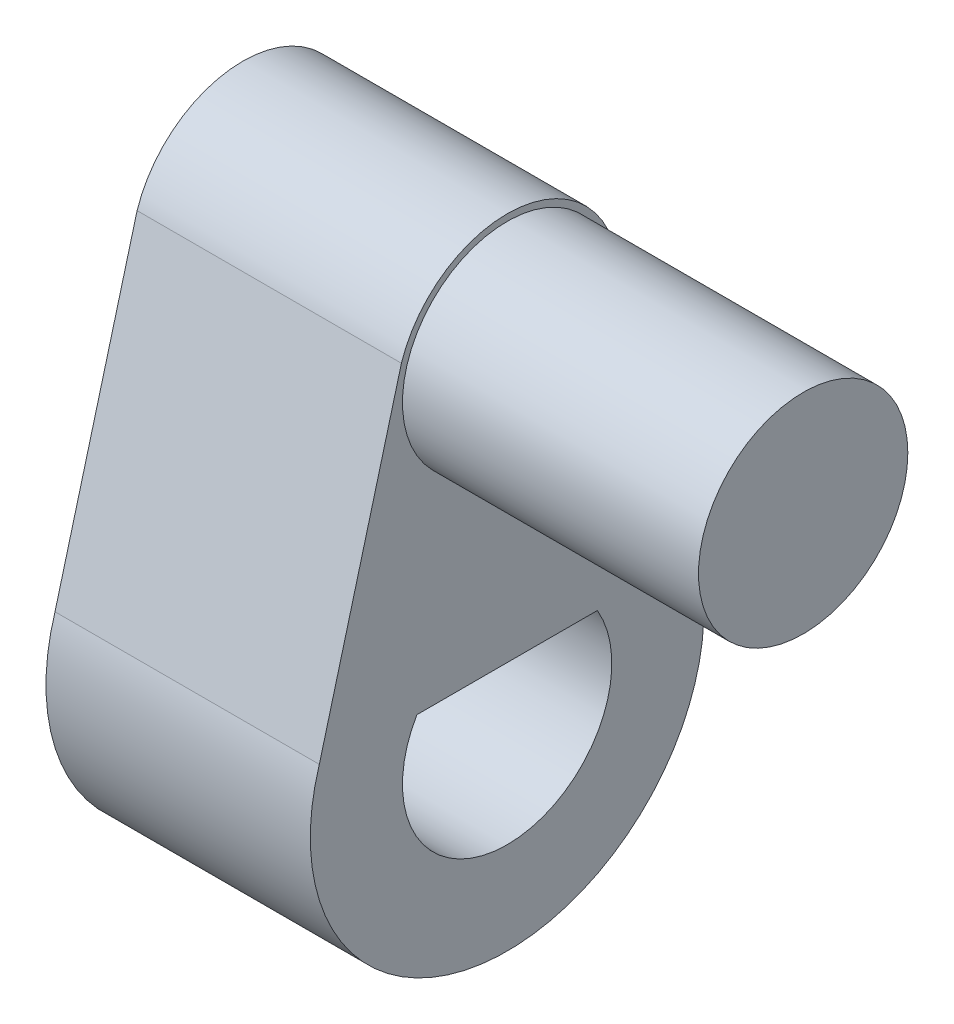
ISO-10303-21;
HEADER;
FILE_DESCRIPTION(('STEP AP214'),'2;1');
FILE_NAME('part.step','',(''),(''),'','','');
FILE_SCHEMA(('AUTOMOTIVE_DESIGN { 1 0 10303 214 1 1 1 1 }'));
ENDSEC;
DATA;
#1=APPLICATION_CONTEXT('core data for automotive mechanical design processes');
#2=APPLICATION_PROTOCOL_DEFINITION('international standard','automotive_design',2000,#1);
#3=PRODUCT_CONTEXT('',#1,'mechanical');
#4=PRODUCT('Part','Part','',(#3));
#5=PRODUCT_RELATED_PRODUCT_CATEGORY('part','',(#4));
#6=PRODUCT_DEFINITION_FORMATION('','',#4);
#7=PRODUCT_DEFINITION_CONTEXT('part definition',#1,'design');
#8=PRODUCT_DEFINITION('design','',#6,#7);
#9=PRODUCT_DEFINITION_SHAPE('','',#8);
#10=(LENGTH_UNIT() NAMED_UNIT(*) SI_UNIT(.MILLI.,.METRE.));
#11=(NAMED_UNIT(*) PLANE_ANGLE_UNIT() SI_UNIT($,.RADIAN.));
#12=(NAMED_UNIT(*) SI_UNIT($,.STERADIAN.) SOLID_ANGLE_UNIT());
#13=UNCERTAINTY_MEASURE_WITH_UNIT(LENGTH_MEASURE(1.E-05),#10,'distance_accuracy_value','');
#14=(GEOMETRIC_REPRESENTATION_CONTEXT(3) GLOBAL_UNCERTAINTY_ASSIGNED_CONTEXT((#13)) GLOBAL_UNIT_ASSIGNED_CONTEXT((#10,
#11,#12)) REPRESENTATION_CONTEXT('',''));
#15=CARTESIAN_POINT('',(0.,0.,0.));
#16=DIRECTION('',(0.,0.,1.));
#17=DIRECTION('',(1.,0.,0.));
#18=AXIS2_PLACEMENT_3D('',#15,#16,#17);
#19=CARTESIAN_POINT('',(2.5,30.6404275633658,53.6707737399797));
#20=DIRECTION('',(-1.,0.,0.));
#21=DIRECTION('',(0.,0.,1.));
#22=AXIS2_PLACEMENT_3D('',#19,#20,#21);
#23=CYLINDRICAL_SURFACE('',#22,1.05254228826987);
#24=CARTESIAN_POINT('',(0.,30.6404275633658,53.6707737399797));
#25=DIRECTION('',(1.,0.,0.));
#26=DIRECTION('',(0.,0.,-1.));
#27=AXIS2_PLACEMENT_3D('',#24,#25,#26);
#28=CIRCLE('',#27,1.05254228826987);
#29=CARTESIAN_POINT('',(0.,30.9688255971547,52.6707737399797));
#30=VERTEX_POINT('',#29);
#31=CARTESIAN_POINT('',(0.,30.9688255971547,54.6707737399797));
#32=VERTEX_POINT('',#31);
#33=EDGE_CURVE('E110',#30,#32,#28,.T.);
#34=ORIENTED_EDGE('',*,*,#33,.T.);
#35=DIRECTION('',(-1.,0.,0.));
#36=VECTOR('',#35,1.);
#37=CARTESIAN_POINT('',(2.5,30.9688255971547,54.6707737399797));
#38=LINE('',#37,#36);
#39=CARTESIAN_POINT('',(2.5,30.9688255971547,54.6707737399797));
#40=VERTEX_POINT('',#39);
#41=EDGE_CURVE('E137',#40,#32,#38,.T.);
#42=ORIENTED_EDGE('',*,*,#41,.F.);
#43=CARTESIAN_POINT('',(2.5,30.6404275633658,53.6707737399797));
#44=DIRECTION('',(1.,0.,0.));
#45=DIRECTION('',(0.,0.,-1.));
#46=AXIS2_PLACEMENT_3D('',#43,#44,#45);
#47=CIRCLE('',#46,1.05254228826987);
#48=CARTESIAN_POINT('',(2.5,30.9688255971547,52.6707737399797));
#49=VERTEX_POINT('',#48);
#50=EDGE_CURVE('E120',#49,#40,#47,.T.);
#51=ORIENTED_EDGE('',*,*,#50,.F.);
#52=DIRECTION('',(-1.,0.,0.));
#53=VECTOR('',#52,1.);
#54=CARTESIAN_POINT('',(2.5,30.9688255971547,52.6707737399797));
#55=LINE('',#54,#53);
#56=EDGE_CURVE('E125',#49,#30,#55,.T.);
#57=ORIENTED_EDGE('',*,*,#56,.T.);
#58=EDGE_LOOP('',(#34,#42,#51,#57));
#59=FACE_BOUND('',#58,.T.);
#60=ADVANCED_FACE('F35',(#59),#23,.T.);
#61=CARTESIAN_POINT('',(2.5,30.9688255971547,54.6707737399797));
#62=DIRECTION('',(0.,-0.258819045102522,-0.965925826289068));
#63=DIRECTION('',(0.,0.965925826289068,-0.258819045102522));
#64=AXIS2_PLACEMENT_3D('',#61,#62,#63);
#65=PLANE('',#64);
#66=DIRECTION('',(0.,-0.965925826289068,0.258819045102522));
#67=VECTOR('',#66,1.);
#68=CARTESIAN_POINT('',(0.,30.9688255971547,54.6707737399797));
#69=LINE('',#68,#67);
#70=CARTESIAN_POINT('',(0.,28.0710481182874,55.4472308752873));
#71=VERTEX_POINT('',#70);
#72=EDGE_CURVE('E113',#32,#71,#69,.T.);
#73=ORIENTED_EDGE('',*,*,#72,.T.);
#74=DIRECTION('',(-1.,0.,0.));
#75=VECTOR('',#74,1.);
#76=CARTESIAN_POINT('',(2.5,28.0710481182874,55.4472308752873));
#77=LINE('',#76,#75);
#78=CARTESIAN_POINT('',(2.5,28.0710481182874,55.4472308752873));
#79=VERTEX_POINT('',#78);
#80=EDGE_CURVE('E134',#79,#71,#77,.T.);
#81=ORIENTED_EDGE('',*,*,#80,.F.);
#82=DIRECTION('',(0.,-0.965925826289068,0.258819045102522));
#83=VECTOR('',#82,1.);
#84=CARTESIAN_POINT('',(2.5,30.9688255971547,54.6707737399797));
#85=LINE('',#84,#83);
#86=EDGE_CURVE('E86',#40,#79,#85,.T.);
#87=ORIENTED_EDGE('',*,*,#86,.F.);
#88=ORIENTED_EDGE('',*,*,#41,.T.);
#89=EDGE_LOOP('',(#73,#81,#87,#88));
#90=FACE_BOUND('',#89,.T.);
#91=ADVANCED_FACE('F156',(#90),#65,.F.);
#92=CARTESIAN_POINT('',(2.5,27.5141959960999,53.6707737399797));
#93=DIRECTION('',(-1.,0.,0.));
#94=DIRECTION('',(0.,0.,1.));
#95=AXIS2_PLACEMENT_3D('',#92,#93,#94);
#96=CYLINDRICAL_SURFACE('',#95,1.86168854526473);
#97=CARTESIAN_POINT('',(0.,27.5141959960999,53.6707737399797));
#98=DIRECTION('',(1.,0.,0.));
#99=DIRECTION('',(0.,0.,-1.));
#100=AXIS2_PLACEMENT_3D('',#97,#98,#99);
#101=CIRCLE('',#100,1.86168854526473);
#102=CARTESIAN_POINT('',(0.,28.0710481182874,51.8943166046722));
#103=VERTEX_POINT('',#102);
#104=EDGE_CURVE('E128',#71,#103,#101,.T.);
#105=ORIENTED_EDGE('',*,*,#104,.T.);
#106=DIRECTION('',(-1.,0.,0.));
#107=VECTOR('',#106,1.);
#108=CARTESIAN_POINT('',(2.5,28.0710481182874,51.8943166046722));
#109=LINE('',#108,#107);
#110=CARTESIAN_POINT('',(2.5,28.0710481182874,51.8943166046722));
#111=VERTEX_POINT('',#110);
#112=EDGE_CURVE('E132',#111,#103,#109,.T.);
#113=ORIENTED_EDGE('',*,*,#112,.F.);
#114=CARTESIAN_POINT('',(2.5,27.5141959960999,53.6707737399797));
#115=DIRECTION('',(1.,0.,0.));
#116=DIRECTION('',(0.,0.,-1.));
#117=AXIS2_PLACEMENT_3D('',#114,#115,#116);
#118=CIRCLE('',#117,1.86168854526473);
#119=EDGE_CURVE('E123',#79,#111,#118,.T.);
#120=ORIENTED_EDGE('',*,*,#119,.F.);
#121=ORIENTED_EDGE('',*,*,#80,.T.);
#122=EDGE_LOOP('',(#105,#113,#120,#121));
#123=FACE_BOUND('',#122,.T.);
#124=ADVANCED_FACE('F160',(#123),#96,.T.);
#125=CARTESIAN_POINT('',(2.5,30.9688255971547,52.6707737399797));
#126=DIRECTION('',(0.,-0.258819045102522,0.965925826289068));
#127=DIRECTION('',(0.,-0.965925826289068,-0.258819045102522));
#128=AXIS2_PLACEMENT_3D('',#125,#126,#127);
#129=PLANE('',#128);
#130=DIRECTION('',(0.,0.965925826289068,0.258819045102522));
#131=VECTOR('',#130,1.);
#132=CARTESIAN_POINT('',(0.,30.9688255971547,52.6707737399797));
#133=LINE('',#132,#131);
#134=EDGE_CURVE('E78',#103,#30,#133,.T.);
#135=ORIENTED_EDGE('',*,*,#134,.T.);
#136=ORIENTED_EDGE('',*,*,#56,.F.);
#137=DIRECTION('',(0.,0.965925826289068,0.258819045102522));
#138=VECTOR('',#137,1.);
#139=CARTESIAN_POINT('',(2.5,30.9688255971547,52.6707737399797));
#140=LINE('',#139,#138);
#141=EDGE_CURVE('E57',#111,#49,#140,.T.);
#142=ORIENTED_EDGE('',*,*,#141,.F.);
#143=ORIENTED_EDGE('',*,*,#112,.T.);
#144=EDGE_LOOP('',(#135,#136,#142,#143));
#145=FACE_BOUND('',#144,.T.);
#146=ADVANCED_FACE('F150',(#145),#129,.F.);
#147=CARTESIAN_POINT('',(2.5,30.6404275633658,53.6707737399797));
#148=DIRECTION('',(1.,0.,0.));
#149=DIRECTION('',(0.,0.,-1.));
#150=AXIS2_PLACEMENT_3D('',#147,#148,#149);
#151=PLANE('',#150);
#152=CARTESIAN_POINT('',(2.5,27.5141959960997,53.6707737399798));
#153=DIRECTION('',(1.,0.,0.));
#154=DIRECTION('',(0.,0.,-1.));
#155=AXIS2_PLACEMENT_3D('',#152,#153,#154);
#156=CIRCLE('',#155,0.989999999999993);
#157=CARTESIAN_POINT('',(2.5,28.0163959156241,54.5239415082585));
#158=VERTEX_POINT('',#157);
#159=CARTESIAN_POINT('',(2.5,28.0163959156241,52.8176059717011));
#160=VERTEX_POINT('',#159);
#161=EDGE_CURVE('E107',#158,#160,#156,.T.);
#162=ORIENTED_EDGE('',*,*,#161,.F.);
#163=DIRECTION('',(0.,0.,-1.));
#164=VECTOR('',#163,1.);
#165=CARTESIAN_POINT('',(2.5,28.0163959156241,54.6674353176535));
#166=LINE('',#165,#164);
#167=EDGE_CURVE('E100',#158,#160,#166,.T.);
#168=ORIENTED_EDGE('',*,*,#167,.T.);
#169=EDGE_LOOP('',(#162,#168));
#170=FACE_BOUND('',#169,.T.);
#171=CARTESIAN_POINT('',(2.5,30.6404275633658,53.6707737399797));
#172=DIRECTION('',(1.,0.,0.));
#173=DIRECTION('',(0.,0.,-1.));
#174=AXIS2_PLACEMENT_3D('',#171,#172,#173);
#175=CIRCLE('',#174,0.990000000000001);
#176=CARTESIAN_POINT('',(2.5,30.6404275633658,52.6807737399797));
#177=VERTEX_POINT('',#176);
#178=EDGE_CURVE('E99',#177,#177,#175,.T.);
#179=ORIENTED_EDGE('',*,*,#178,.F.);
#180=EDGE_LOOP('',(#179));
#181=FACE_BOUND('',#180,.T.);
#182=ORIENTED_EDGE('',*,*,#50,.T.);
#183=ORIENTED_EDGE('',*,*,#86,.T.);
#184=ORIENTED_EDGE('',*,*,#119,.T.);
#185=ORIENTED_EDGE('',*,*,#141,.T.);
#186=EDGE_LOOP('',(#182,#183,#184,#185));
#187=FACE_BOUND('',#186,.T.);
#188=ADVANCED_FACE('F139',(#170,#181,#187),#151,.T.);
#189=CARTESIAN_POINT('',(0.,30.6404275633658,53.6707737399797));
#190=DIRECTION('',(1.,0.,0.));
#191=DIRECTION('',(0.,0.,-1.));
#192=AXIS2_PLACEMENT_3D('',#189,#190,#191);
#193=PLANE('',#192);
#194=DIRECTION('',(0.,0.,1.));
#195=VECTOR('',#194,1.);
#196=CARTESIAN_POINT('',(0.,28.0163959156241,54.6674353176535));
#197=LINE('',#196,#195);
#198=CARTESIAN_POINT('',(0.,28.0163959156241,52.8176059717011));
#199=VERTEX_POINT('',#198);
#200=CARTESIAN_POINT('',(0.,28.0163959156241,54.5239415082585));
#201=VERTEX_POINT('',#200);
#202=EDGE_CURVE('E48',#199,#201,#197,.T.);
#203=ORIENTED_EDGE('',*,*,#202,.T.);
#204=CARTESIAN_POINT('',(0.,27.5141959960997,53.6707737399798));
#205=DIRECTION('',(1.,0.,0.));
#206=DIRECTION('',(0.,0.,-1.));
#207=AXIS2_PLACEMENT_3D('',#204,#205,#206);
#208=CIRCLE('',#207,0.989999999999993);
#209=EDGE_CURVE('E105',#201,#199,#208,.T.);
#210=ORIENTED_EDGE('',*,*,#209,.T.);
#211=EDGE_LOOP('',(#203,#210));
#212=FACE_BOUND('',#211,.T.);
#213=ORIENTED_EDGE('',*,*,#33,.F.);
#214=ORIENTED_EDGE('',*,*,#134,.F.);
#215=ORIENTED_EDGE('',*,*,#104,.F.);
#216=ORIENTED_EDGE('',*,*,#72,.F.);
#217=EDGE_LOOP('',(#213,#214,#215,#216));
#218=FACE_BOUND('',#217,.T.);
#219=ADVANCED_FACE('F108',(#212,#218),#193,.F.);
#220=CARTESIAN_POINT('',(0.,27.5141959960997,53.6707737399798));
#221=DIRECTION('',(1.,0.,0.));
#222=DIRECTION('',(0.,0.,-1.));
#223=AXIS2_PLACEMENT_3D('',#220,#221,#222);
#224=CYLINDRICAL_SURFACE('',#223,0.989999999999993);
#225=ORIENTED_EDGE('',*,*,#161,.T.);
#226=DIRECTION('',(1.,0.,0.));
#227=VECTOR('',#226,1.);
#228=CARTESIAN_POINT('',(0.,28.0163959156241,52.8176059717011));
#229=LINE('',#228,#227);
#230=EDGE_CURVE('E11',#160,#199,#229,.F.);
#231=ORIENTED_EDGE('',*,*,#230,.T.);
#232=ORIENTED_EDGE('',*,*,#209,.F.);
#233=DIRECTION('',(1.,0.,0.));
#234=VECTOR('',#233,1.);
#235=CARTESIAN_POINT('',(0.,28.0163959156241,54.5239415082585));
#236=LINE('',#235,#234);
#237=EDGE_CURVE('E42',#201,#158,#236,.T.);
#238=ORIENTED_EDGE('',*,*,#237,.T.);
#239=EDGE_LOOP('',(#225,#231,#232,#238));
#240=FACE_BOUND('',#239,.T.);
#241=ADVANCED_FACE('F104',(#240),#224,.F.);
#242=CARTESIAN_POINT('',(5.3,30.6404275633658,53.6707737399797));
#243=DIRECTION('',(-1.,0.,0.));
#244=DIRECTION('',(0.,0.,1.));
#245=AXIS2_PLACEMENT_3D('',#242,#243,#244);
#246=CYLINDRICAL_SURFACE('',#245,0.990000000000001);
#247=CARTESIAN_POINT('',(5.3,30.6404275633658,53.6707737399797));
#248=DIRECTION('',(1.,0.,0.));
#249=DIRECTION('',(0.,0.,-1.));
#250=AXIS2_PLACEMENT_3D('',#247,#248,#249);
#251=CIRCLE('',#250,0.990000000000001);
#252=CARTESIAN_POINT('',(5.3,30.6404275633658,52.6807737399797));
#253=VERTEX_POINT('',#252);
#254=EDGE_CURVE('E115',#253,#253,#251,.T.);
#255=ORIENTED_EDGE('',*,*,#254,.F.);
#256=EDGE_LOOP('',(#255));
#257=FACE_BOUND('',#256,.T.);
#258=ORIENTED_EDGE('',*,*,#178,.T.);
#259=EDGE_LOOP('',(#258));
#260=FACE_BOUND('',#259,.T.);
#261=ADVANCED_FACE('F148',(#257,#260),#246,.T.);
#262=CARTESIAN_POINT('',(5.3,30.6404275633658,53.6707737399797));
#263=DIRECTION('',(1.,0.,0.));
#264=DIRECTION('',(0.,0.,-1.));
#265=AXIS2_PLACEMENT_3D('',#262,#263,#264);
#266=PLANE('',#265);
#267=ORIENTED_EDGE('',*,*,#254,.T.);
#268=EDGE_LOOP('',(#267));
#269=FACE_BOUND('',#268,.T.);
#270=ADVANCED_FACE('F195',(#269),#266,.T.);
#271=CARTESIAN_POINT('',(-2.16703056943876,28.0163959156241,54.6674353176535));
#272=DIRECTION('',(0.,-1.,0.));
#273=DIRECTION('',(0.,0.,-1.));
#274=AXIS2_PLACEMENT_3D('',#271,#272,#273);
#275=PLANE('',#274);
#276=ORIENTED_EDGE('',*,*,#230,.F.);
#277=ORIENTED_EDGE('',*,*,#167,.F.);
#278=ORIENTED_EDGE('',*,*,#237,.F.);
#279=ORIENTED_EDGE('',*,*,#202,.F.);
#280=EDGE_LOOP('',(#276,#277,#278,#279));
#281=FACE_BOUND('',#280,.T.);
#282=ADVANCED_FACE('F95',(#281),#275,.T.);
#283=CLOSED_SHELL('',(#60,#91,#124,#146,#188,#219,#241,#261,#270,#282));
#284=MANIFOLD_SOLID_BREP('B2',#283);
#285=ADVANCED_BREP_SHAPE_REPRESENTATION('',(#18,#284),#14);
#286=SHAPE_DEFINITION_REPRESENTATION(#9,#285);
ENDSEC;
END-ISO-10303-21;
